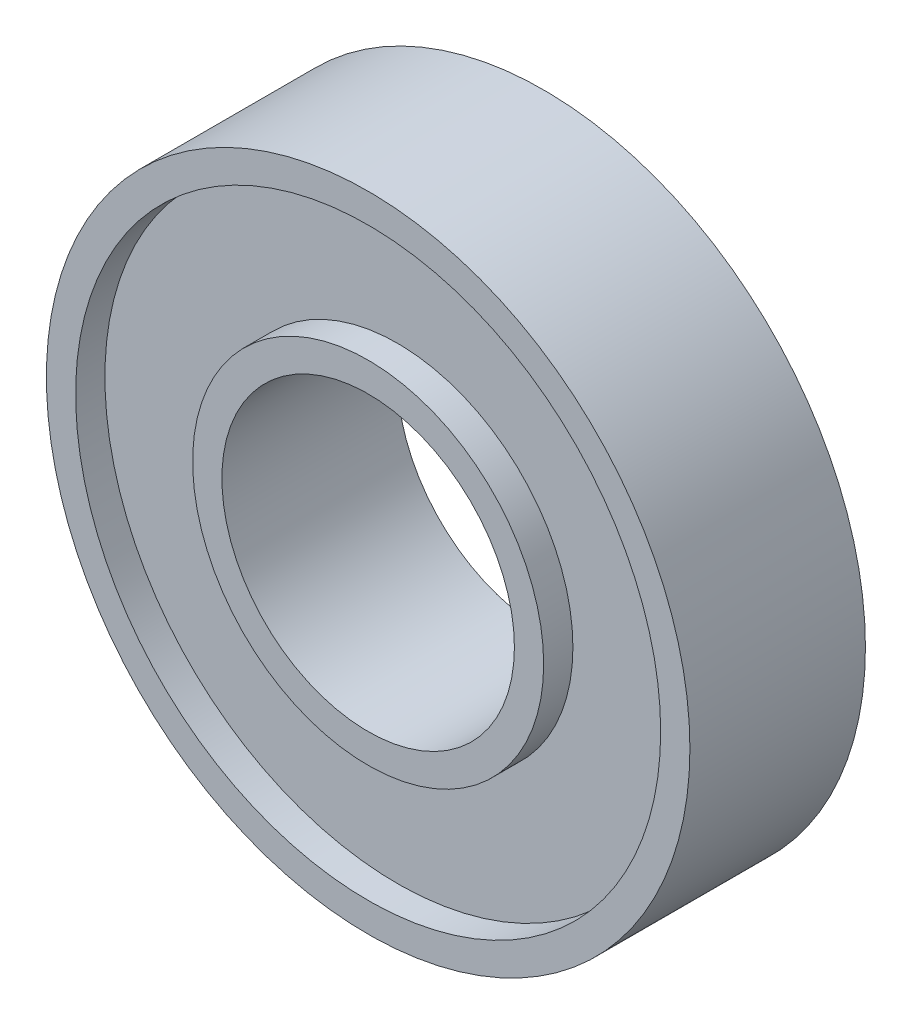
ISO-10303-21;
HEADER;
FILE_DESCRIPTION(('STEP AP214'),'2;1');
FILE_NAME('part.step','',(''),(''),'','','');
FILE_SCHEMA(('AUTOMOTIVE_DESIGN { 1 0 10303 214 1 1 1 1 }'));
ENDSEC;
DATA;
#1=APPLICATION_CONTEXT('core data for automotive mechanical design processes');
#2=APPLICATION_PROTOCOL_DEFINITION('international standard','automotive_design',2000,#1);
#3=PRODUCT_CONTEXT('',#1,'mechanical');
#4=PRODUCT('Part','Part','',(#3));
#5=PRODUCT_RELATED_PRODUCT_CATEGORY('part','',(#4));
#6=PRODUCT_DEFINITION_FORMATION('','',#4);
#7=PRODUCT_DEFINITION_CONTEXT('part definition',#1,'design');
#8=PRODUCT_DEFINITION('design','',#6,#7);
#9=PRODUCT_DEFINITION_SHAPE('','',#8);
#10=(LENGTH_UNIT() NAMED_UNIT(*) SI_UNIT(.MILLI.,.METRE.));
#11=(NAMED_UNIT(*) PLANE_ANGLE_UNIT() SI_UNIT($,.RADIAN.));
#12=(NAMED_UNIT(*) SI_UNIT($,.STERADIAN.) SOLID_ANGLE_UNIT());
#13=UNCERTAINTY_MEASURE_WITH_UNIT(LENGTH_MEASURE(1.E-05),#10,'distance_accuracy_value','');
#14=(GEOMETRIC_REPRESENTATION_CONTEXT(3) GLOBAL_UNCERTAINTY_ASSIGNED_CONTEXT((#13)) GLOBAL_UNIT_ASSIGNED_CONTEXT((#10,
#11,#12)) REPRESENTATION_CONTEXT('',''));
#15=CARTESIAN_POINT('',(0.,0.,0.));
#16=DIRECTION('',(0.,0.,1.));
#17=DIRECTION('',(1.,0.,0.));
#18=AXIS2_PLACEMENT_3D('',#15,#16,#17);
#19=CARTESIAN_POINT('',(0.,11.,3.));
#20=DIRECTION('',(0.,0.,-1.));
#21=DIRECTION('',(-1.,0.,0.));
#22=AXIS2_PLACEMENT_3D('',#19,#20,#21);
#23=PLANE('',#22);
#24=CARTESIAN_POINT('',(0.,0.,3.));
#25=DIRECTION('',(0.,0.,1.));
#26=DIRECTION('',(1.,0.,0.));
#27=AXIS2_PLACEMENT_3D('',#24,#25,#26);
#28=CIRCLE('',#27,10.);
#29=CARTESIAN_POINT('',(10.,0.,3.));
#30=VERTEX_POINT('',#29);
#31=EDGE_CURVE('E10',#30,#30,#28,.T.);
#32=ORIENTED_EDGE('',*,*,#31,.F.);
#33=EDGE_LOOP('',(#32));
#34=FACE_BOUND('',#33,.T.);
#35=CARTESIAN_POINT('',(0.,0.,3.));
#36=DIRECTION('',(0.,0.,1.));
#37=DIRECTION('',(1.,0.,0.));
#38=AXIS2_PLACEMENT_3D('',#35,#36,#37);
#39=CIRCLE('',#38,11.);
#40=CARTESIAN_POINT('',(11.,0.,3.));
#41=VERTEX_POINT('',#40);
#42=EDGE_CURVE('E74',#41,#41,#39,.T.);
#43=ORIENTED_EDGE('',*,*,#42,.T.);
#44=EDGE_LOOP('',(#43));
#45=FACE_BOUND('',#44,.T.);
#46=ADVANCED_FACE('F34',(#34,#45),#23,.F.);
#47=CARTESIAN_POINT('',(0.,0.,0.));
#48=DIRECTION('',(0.,0.,1.));
#49=DIRECTION('',(1.,0.,0.));
#50=AXIS2_PLACEMENT_3D('',#47,#48,#49);
#51=CYLINDRICAL_SURFACE('',#50,10.);
#52=CARTESIAN_POINT('',(0.,0.,2.));
#53=DIRECTION('',(0.,0.,1.));
#54=DIRECTION('',(1.,0.,0.));
#55=AXIS2_PLACEMENT_3D('',#52,#53,#54);
#56=CIRCLE('',#55,10.);
#57=CARTESIAN_POINT('',(10.,0.,2.));
#58=VERTEX_POINT('',#57);
#59=EDGE_CURVE('E40',#58,#58,#56,.T.);
#60=ORIENTED_EDGE('',*,*,#59,.F.);
#61=EDGE_LOOP('',(#60));
#62=FACE_BOUND('',#61,.T.);
#63=ORIENTED_EDGE('',*,*,#31,.T.);
#64=EDGE_LOOP('',(#63));
#65=FACE_BOUND('',#64,.T.);
#66=ADVANCED_FACE('F135',(#62,#65),#51,.F.);
#67=CARTESIAN_POINT('',(0.,10.,2.));
#68=DIRECTION('',(0.,0.,-1.));
#69=DIRECTION('',(-1.,0.,0.));
#70=AXIS2_PLACEMENT_3D('',#67,#68,#69);
#71=PLANE('',#70);
#72=CARTESIAN_POINT('',(0.,0.,2.));
#73=DIRECTION('',(0.,0.,1.));
#74=DIRECTION('',(1.,0.,0.));
#75=AXIS2_PLACEMENT_3D('',#72,#73,#74);
#76=CIRCLE('',#75,6.);
#77=CARTESIAN_POINT('',(6.,0.,2.));
#78=VERTEX_POINT('',#77);
#79=EDGE_CURVE('E44',#78,#78,#76,.T.);
#80=ORIENTED_EDGE('',*,*,#79,.F.);
#81=EDGE_LOOP('',(#80));
#82=FACE_BOUND('',#81,.T.);
#83=ORIENTED_EDGE('',*,*,#59,.T.);
#84=EDGE_LOOP('',(#83));
#85=FACE_BOUND('',#84,.T.);
#86=ADVANCED_FACE('F130',(#82,#85),#71,.F.);
#87=CARTESIAN_POINT('',(0.,0.,0.));
#88=DIRECTION('',(0.,0.,1.));
#89=DIRECTION('',(1.,0.,0.));
#90=AXIS2_PLACEMENT_3D('',#87,#88,#89);
#91=CYLINDRICAL_SURFACE('',#90,6.);
#92=CARTESIAN_POINT('',(0.,0.,3.));
#93=DIRECTION('',(0.,0.,1.));
#94=DIRECTION('',(1.,0.,0.));
#95=AXIS2_PLACEMENT_3D('',#92,#93,#94);
#96=CIRCLE('',#95,6.);
#97=CARTESIAN_POINT('',(6.,0.,3.));
#98=VERTEX_POINT('',#97);
#99=EDGE_CURVE('E48',#98,#98,#96,.T.);
#100=ORIENTED_EDGE('',*,*,#99,.F.);
#101=EDGE_LOOP('',(#100));
#102=FACE_BOUND('',#101,.T.);
#103=ORIENTED_EDGE('',*,*,#79,.T.);
#104=EDGE_LOOP('',(#103));
#105=FACE_BOUND('',#104,.T.);
#106=ADVANCED_FACE('F124',(#102,#105),#91,.T.);
#107=CARTESIAN_POINT('',(0.,6.,3.));
#108=DIRECTION('',(0.,0.,-1.));
#109=DIRECTION('',(-1.,0.,0.));
#110=AXIS2_PLACEMENT_3D('',#107,#108,#109);
#111=PLANE('',#110);
#112=CARTESIAN_POINT('',(0.,0.,3.));
#113=DIRECTION('',(0.,0.,1.));
#114=DIRECTION('',(1.,0.,0.));
#115=AXIS2_PLACEMENT_3D('',#112,#113,#114);
#116=CIRCLE('',#115,5.);
#117=CARTESIAN_POINT('',(5.,0.,3.));
#118=VERTEX_POINT('',#117);
#119=EDGE_CURVE('E53',#118,#118,#116,.T.);
#120=ORIENTED_EDGE('',*,*,#119,.F.);
#121=EDGE_LOOP('',(#120));
#122=FACE_BOUND('',#121,.T.);
#123=ORIENTED_EDGE('',*,*,#99,.T.);
#124=EDGE_LOOP('',(#123));
#125=FACE_BOUND('',#124,.T.);
#126=ADVANCED_FACE('F118',(#122,#125),#111,.F.);
#127=CARTESIAN_POINT('',(0.,0.,0.));
#128=DIRECTION('',(0.,0.,1.));
#129=DIRECTION('',(1.,0.,0.));
#130=AXIS2_PLACEMENT_3D('',#127,#128,#129);
#131=CYLINDRICAL_SURFACE('',#130,5.);
#132=CARTESIAN_POINT('',(0.,0.,-3.));
#133=DIRECTION('',(0.,0.,1.));
#134=DIRECTION('',(1.,0.,0.));
#135=AXIS2_PLACEMENT_3D('',#132,#133,#134);
#136=CIRCLE('',#135,5.);
#137=CARTESIAN_POINT('',(5.,0.,-3.));
#138=VERTEX_POINT('',#137);
#139=EDGE_CURVE('E56',#138,#138,#136,.T.);
#140=ORIENTED_EDGE('',*,*,#139,.F.);
#141=EDGE_LOOP('',(#140));
#142=FACE_BOUND('',#141,.T.);
#143=ORIENTED_EDGE('',*,*,#119,.T.);
#144=EDGE_LOOP('',(#143));
#145=FACE_BOUND('',#144,.T.);
#146=ADVANCED_FACE('F112',(#142,#145),#131,.F.);
#147=CARTESIAN_POINT('',(0.,6.,-3.));
#148=DIRECTION('',(0.,0.,1.));
#149=DIRECTION('',(1.,0.,0.));
#150=AXIS2_PLACEMENT_3D('',#147,#148,#149);
#151=PLANE('',#150);
#152=CARTESIAN_POINT('',(0.,0.,-3.));
#153=DIRECTION('',(0.,0.,1.));
#154=DIRECTION('',(1.,0.,0.));
#155=AXIS2_PLACEMENT_3D('',#152,#153,#154);
#156=CIRCLE('',#155,6.);
#157=CARTESIAN_POINT('',(6.,0.,-3.));
#158=VERTEX_POINT('',#157);
#159=EDGE_CURVE('E59',#158,#158,#156,.T.);
#160=ORIENTED_EDGE('',*,*,#159,.F.);
#161=EDGE_LOOP('',(#160));
#162=FACE_BOUND('',#161,.T.);
#163=ORIENTED_EDGE('',*,*,#139,.T.);
#164=EDGE_LOOP('',(#163));
#165=FACE_BOUND('',#164,.T.);
#166=ADVANCED_FACE('F106',(#162,#165),#151,.F.);
#167=CARTESIAN_POINT('',(0.,0.,0.));
#168=DIRECTION('',(0.,0.,1.));
#169=DIRECTION('',(1.,0.,0.));
#170=AXIS2_PLACEMENT_3D('',#167,#168,#169);
#171=CYLINDRICAL_SURFACE('',#170,6.);
#172=CARTESIAN_POINT('',(0.,0.,-2.));
#173=DIRECTION('',(0.,0.,1.));
#174=DIRECTION('',(1.,0.,0.));
#175=AXIS2_PLACEMENT_3D('',#172,#173,#174);
#176=CIRCLE('',#175,6.);
#177=CARTESIAN_POINT('',(6.,0.,-2.));
#178=VERTEX_POINT('',#177);
#179=EDGE_CURVE('E62',#178,#178,#176,.T.);
#180=ORIENTED_EDGE('',*,*,#179,.F.);
#181=EDGE_LOOP('',(#180));
#182=FACE_BOUND('',#181,.T.);
#183=ORIENTED_EDGE('',*,*,#159,.T.);
#184=EDGE_LOOP('',(#183));
#185=FACE_BOUND('',#184,.T.);
#186=ADVANCED_FACE('F100',(#182,#185),#171,.T.);
#187=CARTESIAN_POINT('',(0.,10.,-2.));
#188=DIRECTION('',(0.,0.,1.));
#189=DIRECTION('',(1.,0.,0.));
#190=AXIS2_PLACEMENT_3D('',#187,#188,#189);
#191=PLANE('',#190);
#192=CARTESIAN_POINT('',(0.,0.,-2.));
#193=DIRECTION('',(0.,0.,1.));
#194=DIRECTION('',(1.,0.,0.));
#195=AXIS2_PLACEMENT_3D('',#192,#193,#194);
#196=CIRCLE('',#195,10.);
#197=CARTESIAN_POINT('',(10.,0.,-2.));
#198=VERTEX_POINT('',#197);
#199=EDGE_CURVE('E65',#198,#198,#196,.T.);
#200=ORIENTED_EDGE('',*,*,#199,.F.);
#201=EDGE_LOOP('',(#200));
#202=FACE_BOUND('',#201,.T.);
#203=ORIENTED_EDGE('',*,*,#179,.T.);
#204=EDGE_LOOP('',(#203));
#205=FACE_BOUND('',#204,.T.);
#206=ADVANCED_FACE('F94',(#202,#205),#191,.F.);
#207=CARTESIAN_POINT('',(0.,0.,0.));
#208=DIRECTION('',(0.,0.,1.));
#209=DIRECTION('',(1.,0.,0.));
#210=AXIS2_PLACEMENT_3D('',#207,#208,#209);
#211=CYLINDRICAL_SURFACE('',#210,10.);
#212=CARTESIAN_POINT('',(0.,0.,-3.));
#213=DIRECTION('',(0.,0.,1.));
#214=DIRECTION('',(1.,0.,0.));
#215=AXIS2_PLACEMENT_3D('',#212,#213,#214);
#216=CIRCLE('',#215,10.);
#217=CARTESIAN_POINT('',(10.,0.,-3.));
#218=VERTEX_POINT('',#217);
#219=EDGE_CURVE('E68',#218,#218,#216,.T.);
#220=ORIENTED_EDGE('',*,*,#219,.F.);
#221=EDGE_LOOP('',(#220));
#222=FACE_BOUND('',#221,.T.);
#223=ORIENTED_EDGE('',*,*,#199,.T.);
#224=EDGE_LOOP('',(#223));
#225=FACE_BOUND('',#224,.T.);
#226=ADVANCED_FACE('F88',(#222,#225),#211,.F.);
#227=CARTESIAN_POINT('',(0.,11.,-3.));
#228=DIRECTION('',(0.,0.,1.));
#229=DIRECTION('',(1.,0.,0.));
#230=AXIS2_PLACEMENT_3D('',#227,#228,#229);
#231=PLANE('',#230);
#232=CARTESIAN_POINT('',(0.,0.,-3.));
#233=DIRECTION('',(0.,0.,1.));
#234=DIRECTION('',(1.,0.,0.));
#235=AXIS2_PLACEMENT_3D('',#232,#233,#234);
#236=CIRCLE('',#235,11.);
#237=CARTESIAN_POINT('',(11.,0.,-3.));
#238=VERTEX_POINT('',#237);
#239=EDGE_CURVE('E71',#238,#238,#236,.T.);
#240=ORIENTED_EDGE('',*,*,#239,.F.);
#241=EDGE_LOOP('',(#240));
#242=FACE_BOUND('',#241,.T.);
#243=ORIENTED_EDGE('',*,*,#219,.T.);
#244=EDGE_LOOP('',(#243));
#245=FACE_BOUND('',#244,.T.);
#246=ADVANCED_FACE('F82',(#242,#245),#231,.F.);
#247=CARTESIAN_POINT('',(0.,0.,0.));
#248=DIRECTION('',(0.,0.,1.));
#249=DIRECTION('',(1.,0.,0.));
#250=AXIS2_PLACEMENT_3D('',#247,#248,#249);
#251=CYLINDRICAL_SURFACE('',#250,11.);
#252=ORIENTED_EDGE('',*,*,#42,.F.);
#253=EDGE_LOOP('',(#252));
#254=FACE_BOUND('',#253,.T.);
#255=ORIENTED_EDGE('',*,*,#239,.T.);
#256=EDGE_LOOP('',(#255));
#257=FACE_BOUND('',#256,.T.);
#258=ADVANCED_FACE('F79',(#254,#257),#251,.T.);
#259=CLOSED_SHELL('',(#46,#66,#86,#106,#126,#146,#166,#186,#206,#226,#246,#258));
#260=MANIFOLD_SOLID_BREP('B2',#259);
#261=ADVANCED_BREP_SHAPE_REPRESENTATION('',(#18,#260),#14);
#262=SHAPE_DEFINITION_REPRESENTATION(#9,#261);
ENDSEC;
END-ISO-10303-21;
